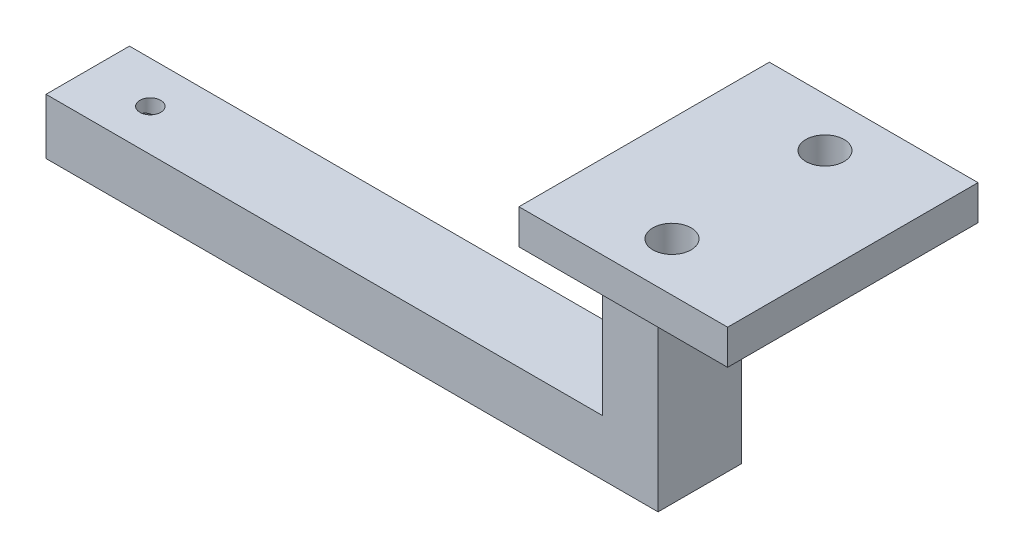
ISO-10303-21;
HEADER;
FILE_DESCRIPTION(('STEP AP214'),'2;1');
FILE_NAME('part.step','',(''),(''),'','','');
FILE_SCHEMA(('AUTOMOTIVE_DESIGN { 1 0 10303 214 1 1 1 1 }'));
ENDSEC;
DATA;
#1=APPLICATION_CONTEXT('core data for automotive mechanical design processes');
#2=APPLICATION_PROTOCOL_DEFINITION('international standard','automotive_design',2000,#1);
#3=PRODUCT_CONTEXT('',#1,'mechanical');
#4=PRODUCT('Part','Part','',(#3));
#5=PRODUCT_RELATED_PRODUCT_CATEGORY('part','',(#4));
#6=PRODUCT_DEFINITION_FORMATION('','',#4);
#7=PRODUCT_DEFINITION_CONTEXT('part definition',#1,'design');
#8=PRODUCT_DEFINITION('design','',#6,#7);
#9=PRODUCT_DEFINITION_SHAPE('','',#8);
#10=(LENGTH_UNIT() NAMED_UNIT(*) SI_UNIT(.MILLI.,.METRE.));
#11=(NAMED_UNIT(*) PLANE_ANGLE_UNIT() SI_UNIT($,.RADIAN.));
#12=(NAMED_UNIT(*) SI_UNIT($,.STERADIAN.) SOLID_ANGLE_UNIT());
#13=UNCERTAINTY_MEASURE_WITH_UNIT(LENGTH_MEASURE(1.E-05),#10,'distance_accuracy_value','');
#14=(GEOMETRIC_REPRESENTATION_CONTEXT(3) GLOBAL_UNCERTAINTY_ASSIGNED_CONTEXT((#13)) GLOBAL_UNIT_ASSIGNED_CONTEXT((#10,
#11,#12)) REPRESENTATION_CONTEXT('',''));
#15=CARTESIAN_POINT('',(0.,0.,0.));
#16=DIRECTION('',(0.,0.,1.));
#17=DIRECTION('',(1.,0.,0.));
#18=AXIS2_PLACEMENT_3D('',#15,#16,#17);
#19=CARTESIAN_POINT('',(0.,0.,12.));
#20=DIRECTION('',(-1.,0.,0.));
#21=DIRECTION('',(0.,0.,1.));
#22=AXIS2_PLACEMENT_3D('',#19,#20,#21);
#23=PLANE('',#22);
#24=DIRECTION('',(0.,0.,-1.));
#25=VECTOR('',#24,1.);
#26=CARTESIAN_POINT('',(0.,35.,12.));
#27=LINE('',#26,#25);
#28=CARTESIAN_POINT('',(0.,35.,12.));
#29=VERTEX_POINT('',#28);
#30=CARTESIAN_POINT('',(0.,35.,0.));
#31=VERTEX_POINT('',#30);
#32=EDGE_CURVE('E150',#29,#31,#27,.T.);
#33=ORIENTED_EDGE('',*,*,#32,.F.);
#34=DIRECTION('',(0.,1.,0.));
#35=VECTOR('',#34,1.);
#36=CARTESIAN_POINT('',(0.,0.,12.));
#37=LINE('',#36,#35);
#38=CARTESIAN_POINT('',(0.,0.,12.));
#39=VERTEX_POINT('',#38);
#40=EDGE_CURVE('E176',#39,#29,#37,.T.);
#41=ORIENTED_EDGE('',*,*,#40,.F.);
#42=DIRECTION('',(0.,0.,-1.));
#43=VECTOR('',#42,1.);
#44=CARTESIAN_POINT('',(0.,0.,12.));
#45=LINE('',#44,#43);
#46=CARTESIAN_POINT('',(0.,0.,0.));
#47=VERTEX_POINT('',#46);
#48=EDGE_CURVE('E207',#39,#47,#45,.T.);
#49=ORIENTED_EDGE('',*,*,#48,.T.);
#50=DIRECTION('',(0.,1.,0.));
#51=VECTOR('',#50,1.);
#52=CARTESIAN_POINT('',(0.,0.,0.));
#53=LINE('',#52,#51);
#54=EDGE_CURVE('E189',#47,#31,#53,.T.);
#55=ORIENTED_EDGE('',*,*,#54,.T.);
#56=EDGE_LOOP('',(#33,#41,#49,#55));
#57=FACE_BOUND('',#56,.T.);
#58=ADVANCED_FACE('F35',(#57),#23,.F.);
#59=CARTESIAN_POINT('',(0.,0.,12.));
#60=DIRECTION('',(0.,0.,1.));
#61=DIRECTION('',(1.,0.,0.));
#62=AXIS2_PLACEMENT_3D('',#59,#60,#61);
#63=PLANE('',#62);
#64=ORIENTED_EDGE('',*,*,#40,.T.);
#65=DIRECTION('',(-1.,0.,0.));
#66=VECTOR('',#65,1.);
#67=CARTESIAN_POINT('',(0.,35.,12.));
#68=LINE('',#67,#66);
#69=CARTESIAN_POINT('',(-8.,35.,12.));
#70=VERTEX_POINT('',#69);
#71=EDGE_CURVE('E152',#29,#70,#68,.T.);
#72=ORIENTED_EDGE('',*,*,#71,.T.);
#73=DIRECTION('',(0.,-1.,0.));
#74=VECTOR('',#73,1.);
#75=CARTESIAN_POINT('',(-8.,40.,12.));
#76=LINE('',#75,#74);
#77=CARTESIAN_POINT('',(-8.,8.00000000000001,12.));
#78=VERTEX_POINT('',#77);
#79=EDGE_CURVE('E180',#70,#78,#76,.T.);
#80=ORIENTED_EDGE('',*,*,#79,.T.);
#81=DIRECTION('',(-1.,0.,0.));
#82=VECTOR('',#81,1.);
#83=CARTESIAN_POINT('',(-8.,8.00000000000001,12.));
#84=LINE('',#83,#82);
#85=CARTESIAN_POINT('',(-88.,8.,12.));
#86=VERTEX_POINT('',#85);
#87=EDGE_CURVE('E182',#78,#86,#84,.T.);
#88=ORIENTED_EDGE('',*,*,#87,.T.);
#89=DIRECTION('',(0.,-1.,0.));
#90=VECTOR('',#89,1.);
#91=CARTESIAN_POINT('',(-88.,8.,12.));
#92=LINE('',#91,#90);
#93=CARTESIAN_POINT('',(-88.,0.,12.));
#94=VERTEX_POINT('',#93);
#95=EDGE_CURVE('E184',#86,#94,#92,.T.);
#96=ORIENTED_EDGE('',*,*,#95,.T.);
#97=DIRECTION('',(1.,0.,0.));
#98=VECTOR('',#97,1.);
#99=CARTESIAN_POINT('',(-88.,0.,12.));
#100=LINE('',#99,#98);
#101=EDGE_CURVE('E173',#94,#39,#100,.T.);
#102=ORIENTED_EDGE('',*,*,#101,.T.);
#103=EDGE_LOOP('',(#64,#72,#80,#88,#96,#102));
#104=FACE_BOUND('',#103,.T.);
#105=ADVANCED_FACE('F265',(#104),#63,.T.);
#106=CARTESIAN_POINT('',(0.,0.,0.));
#107=DIRECTION('',(0.,0.,1.));
#108=DIRECTION('',(1.,0.,0.));
#109=AXIS2_PLACEMENT_3D('',#106,#107,#108);
#110=PLANE('',#109);
#111=DIRECTION('',(-1.,0.,0.));
#112=VECTOR('',#111,1.);
#113=CARTESIAN_POINT('',(0.,35.,0.));
#114=LINE('',#113,#112);
#115=CARTESIAN_POINT('',(-8.,35.,0.));
#116=VERTEX_POINT('',#115);
#117=EDGE_CURVE('E11',#31,#116,#114,.T.);
#118=ORIENTED_EDGE('',*,*,#117,.F.);
#119=ORIENTED_EDGE('',*,*,#54,.F.);
#120=DIRECTION('',(1.,0.,0.));
#121=VECTOR('',#120,1.);
#122=CARTESIAN_POINT('',(-88.,0.,0.));
#123=LINE('',#122,#121);
#124=CARTESIAN_POINT('',(-88.,0.,0.));
#125=VERTEX_POINT('',#124);
#126=EDGE_CURVE('E172',#125,#47,#123,.T.);
#127=ORIENTED_EDGE('',*,*,#126,.F.);
#128=DIRECTION('',(0.,-1.,0.));
#129=VECTOR('',#128,1.);
#130=CARTESIAN_POINT('',(-88.,8.,0.));
#131=LINE('',#130,#129);
#132=CARTESIAN_POINT('',(-88.,8.,0.));
#133=VERTEX_POINT('',#132);
#134=EDGE_CURVE('E177',#133,#125,#131,.T.);
#135=ORIENTED_EDGE('',*,*,#134,.F.);
#136=DIRECTION('',(-1.,0.,0.));
#137=VECTOR('',#136,1.);
#138=CARTESIAN_POINT('',(-8.,8.00000000000001,0.));
#139=LINE('',#138,#137);
#140=CARTESIAN_POINT('',(-8.,8.00000000000001,0.));
#141=VERTEX_POINT('',#140);
#142=EDGE_CURVE('E194',#141,#133,#139,.T.);
#143=ORIENTED_EDGE('',*,*,#142,.F.);
#144=DIRECTION('',(0.,-1.,0.));
#145=VECTOR('',#144,1.);
#146=CARTESIAN_POINT('',(-8.,40.,0.));
#147=LINE('',#146,#145);
#148=EDGE_CURVE('E192',#116,#141,#147,.T.);
#149=ORIENTED_EDGE('',*,*,#148,.F.);
#150=EDGE_LOOP('',(#118,#119,#127,#135,#143,#149));
#151=FACE_BOUND('',#150,.T.);
#152=ADVANCED_FACE('F270',(#151),#110,.F.);
#153=CARTESIAN_POINT('',(-79.,-4.,6.00000000000001));
#154=DIRECTION('',(0.,1.,0.));
#155=DIRECTION('',(-1.,0.,0.));
#156=AXIS2_PLACEMENT_3D('',#153,#154,#155);
#157=CYLINDRICAL_SURFACE('',#156,1.5);
#158=CARTESIAN_POINT('',(-79.,0.,6.00000000000001));
#159=DIRECTION('',(0.,1.,0.));
#160=DIRECTION('',(0.,0.,1.));
#161=AXIS2_PLACEMENT_3D('',#158,#159,#160);
#162=CIRCLE('',#161,1.5);
#163=CARTESIAN_POINT('',(-79.,0.,7.50000000000001));
#164=VERTEX_POINT('',#163);
#165=EDGE_CURVE('E169',#164,#164,#162,.T.);
#166=ORIENTED_EDGE('',*,*,#165,.F.);
#167=EDGE_LOOP('',(#166));
#168=FACE_BOUND('',#167,.T.);
#169=CARTESIAN_POINT('',(-79.,8.,6.00000000000001));
#170=DIRECTION('',(0.,1.,0.));
#171=DIRECTION('',(-1.,0.,0.));
#172=AXIS2_PLACEMENT_3D('',#169,#170,#171);
#173=CIRCLE('',#172,1.5);
#174=CARTESIAN_POINT('',(-80.5,8.,6.00000000000001));
#175=VERTEX_POINT('',#174);
#176=EDGE_CURVE('E166',#175,#175,#173,.T.);
#177=ORIENTED_EDGE('',*,*,#176,.T.);
#178=EDGE_LOOP('',(#177));
#179=FACE_BOUND('',#178,.T.);
#180=DIRECTION('',(0.,1.,0.));
#181=VECTOR('',#180,1.);
#182=CARTESIAN_POINT('',(-79.,-4.,7.50000000000001));
#183=LINE('',#182,#181);
#184=CARTESIAN_POINT('',(-79.,5.67705098312484,7.50000000000001));
#185=VERTEX_POINT('',#184);
#186=CARTESIAN_POINT('',(-79.,2.32294901687516,7.50000000000001));
#187=VERTEX_POINT('',#186);
#188=EDGE_CURVE('E44',#185,#187,#183,.F.);
#189=ORIENTED_EDGE('',*,*,#188,.F.);
#190=CARTESIAN_POINT('',(-79.,5.67705098312484,7.50000000000001));
#191=CARTESIAN_POINT('',(-79.0368737272381,5.67703067467632,7.50000961376509));
#192=CARTESIAN_POINT('',(-79.0737348229495,5.67826657678591,7.49864076162754));
#193=CARTESIAN_POINT('',(-79.1470562549286,5.68309455362902,7.49322342700927));
#194=CARTESIAN_POINT('',(-79.1835170617744,5.68668347083958,7.48917853545359));
#195=CARTESIAN_POINT('',(-79.255406471104,5.69601572525516,7.47853880590408));
#196=CARTESIAN_POINT('',(-79.2908417088637,5.70173745357129,7.4719695241817));
#197=CARTESIAN_POINT('',(-79.3608074285523,5.71508074522219,7.45640091046217));
#198=CARTESIAN_POINT('',(-79.3953376441059,5.7227028611102,7.44740087163904));
#199=CARTESIAN_POINT('',(-79.4969137851983,5.74789625130087,7.41705570383185));
#200=CARTESIAN_POINT('',(-79.5623786136168,5.76785698911783,7.39229898340003));
#201=CARTESIAN_POINT('',(-79.688251672616,5.81181841370198,7.33459008750629));
#202=CARTESIAN_POINT('',(-79.7486448716587,5.83583051616502,7.30161462484354));
#203=CARTESIAN_POINT('',(-79.872749943181,5.88960327142749,7.22250683593719));
#204=CARTESIAN_POINT('',(-79.9355336804138,5.91967897989029,7.17512904818831));
#205=CARTESIAN_POINT('',(-80.0530342315155,5.97960330566497,7.07111173647231));
#206=CARTESIAN_POINT('',(-80.1077477189671,6.00945182455246,7.01446841358679));
#207=CARTESIAN_POINT('',(-80.2154796019136,6.07066451454946,6.88362112846635));
#208=CARTESIAN_POINT('',(-80.2671068209244,6.10162290735535,6.80806212468701));
#209=CARTESIAN_POINT('',(-80.3564780428269,6.15668632689625,6.64686141885877));
#210=CARTESIAN_POINT('',(-80.3942362392146,6.18079835440094,6.5612301439194));
#211=CARTESIAN_POINT('',(-80.4501673755483,6.21699936644745,6.39243652101455));
#212=CARTESIAN_POINT('',(-80.4700626452566,6.23013391051135,6.31007545310938));
#213=CARTESIAN_POINT('',(-80.495638413666,6.24707311914143,6.14227097413039));
#214=CARTESIAN_POINT('',(-80.5013369150397,6.25088959965741,6.05683160629038));
#215=CARTESIAN_POINT('',(-80.4983706611973,6.24891521257682,5.89938970239933));
#216=CARTESIAN_POINT('',(-80.4917582097064,6.2444969854291,5.82731950071986));
#217=CARTESIAN_POINT('',(-80.4684317065219,6.22906136785031,5.68557100471714));
#218=CARTESIAN_POINT('',(-80.4517169210434,6.21804349805346,5.61589288453176));
#219=CARTESIAN_POINT('',(-80.4091032402396,6.19039068899814,5.48094155366911));
#220=CARTESIAN_POINT('',(-80.3832408478575,6.17377808758957,5.41565204526851));
#221=CARTESIAN_POINT('',(-80.323334768453,6.13615828863141,5.29034314982622));
#222=CARTESIAN_POINT('',(-80.2892895863376,6.11515028808117,5.23032472861416));
#223=CARTESIAN_POINT('',(-80.2090153610089,6.06713506872456,5.10878585132561));
#224=CARTESIAN_POINT('',(-80.161773105589,6.03970226477187,5.04810463700618));
#225=CARTESIAN_POINT('',(-80.0590742815934,5.98300368004118,4.93500743627833));
#226=CARTESIAN_POINT('',(-80.0036052745488,5.95373516310972,4.88260421798713));
#227=CARTESIAN_POINT('',(-79.8760380413454,5.89113018974347,4.77921630448056));
#228=CARTESIAN_POINT('',(-79.8026949930549,5.857866938289,4.72971244142493));
#229=CARTESIAN_POINT('',(-79.6468899250284,5.79607563731148,4.64374922011654));
#230=CARTESIAN_POINT('',(-79.5644407795887,5.76754104163314,4.60727174643706));
#231=CARTESIAN_POINT('',(-79.416007710492,5.72684542118096,4.55735028799181));
#232=CARTESIAN_POINT('',(-79.3518757751779,5.71233693234825,4.54031691504824));
#233=CARTESIAN_POINT('',(-79.2208496796857,5.69031117927188,4.51485953286931));
#234=CARTESIAN_POINT('',(-79.1539654762302,5.68277069278361,4.50640691721251));
#235=CARTESIAN_POINT('',(-79.0722838158817,5.67854474224225,4.50167205945649));
#236=CARTESIAN_POINT('',(-79.0578380103831,5.67798516974101,4.50104528821663));
#237=CARTESIAN_POINT('',(-79.028929713638,5.67723891261461,4.50020974713611));
#238=CARTESIAN_POINT('',(-79.0144672299445,5.67705209833551,4.50000083195537));
#239=CARTESIAN_POINT('',(-78.9999999999999,5.67705098312628,4.5));
#240=B_SPLINE_CURVE_WITH_KNOTS('',3,(#190,#191,#192,#193,#194,#195,#196,#197,#198,#199,#200,
#201,#202,#203,#204,#205,#206,#207,#208,#209,#210,#211,#212,#213,#214,#215,#216,#217,#218,#219,
#220,#221,#222,#223,#224,#225,#226,#227,#228,#229,#230,#231,#232,#233,#234,#235,#236,#237,#238,
#239),.UNSPECIFIED.,.F.,.F.,(4,2,2,2,2,2,2,2,2,2,2,2,2,2,2,2,2,2,2,2,2,2,2,2,4),(0.,
0.110554725515257,0.220961399887614,0.330278601396378,0.439627624917945,0.657013960845389,
0.87502339018235,1.12670489505225,1.37848985051489,1.66671240875328,1.95463917401578,
2.210255480478,2.46554747902458,2.68201999729834,2.89850824098444,3.11414217137482,
3.32981553063517,3.57383340863398,3.81822406427426,4.10052257128099,4.38242695081471,
4.58541483303322,4.78772375216627,4.83112836335763,4.87451787478567),.UNSPECIFIED.);
#241=CARTESIAN_POINT('',(-79.,5.67705098312485,4.50000000000001));
#242=VERTEX_POINT('',#241);
#243=EDGE_CURVE('E212',#185,#242,#240,.T.);
#244=ORIENTED_EDGE('',*,*,#243,.T.);
#245=DIRECTION('',(0.,1.,0.));
#246=VECTOR('',#245,1.);
#247=CARTESIAN_POINT('',(-79.,-4.,4.50000000000001));
#248=LINE('',#247,#246);
#249=CARTESIAN_POINT('',(-79.,2.32294901687515,4.50000000000001));
#250=VERTEX_POINT('',#249);
#251=EDGE_CURVE('E210',#250,#242,#248,.T.);
#252=ORIENTED_EDGE('',*,*,#251,.F.);
#253=CARTESIAN_POINT('',(-79.,2.32294901687515,4.50000000000001));
#254=CARTESIAN_POINT('',(-79.0368737272381,2.32296932532366,4.49999038623492));
#255=CARTESIAN_POINT('',(-79.0737348229495,2.32173342321407,4.50135923837248));
#256=CARTESIAN_POINT('',(-79.1470562549286,2.31690544637096,4.50677657299075));
#257=CARTESIAN_POINT('',(-79.1835170617744,2.3133165291604,4.51082146454643));
#258=CARTESIAN_POINT('',(-79.255406471104,2.30398427474482,4.52146119409594));
#259=CARTESIAN_POINT('',(-79.2908417088637,2.29826254642869,4.52803047581832));
#260=CARTESIAN_POINT('',(-79.3608074285523,2.28491925477779,4.54359908953785));
#261=CARTESIAN_POINT('',(-79.3953376441059,2.27729713888978,4.55259912836098));
#262=CARTESIAN_POINT('',(-79.4969137851983,2.25210374869911,4.58294429616817));
#263=CARTESIAN_POINT('',(-79.5623786136168,2.23214301088215,4.60770101659999));
#264=CARTESIAN_POINT('',(-79.688251672616,2.18818158629801,4.66540991249373));
#265=CARTESIAN_POINT('',(-79.7486448716587,2.16416948383496,4.69838537515649));
#266=CARTESIAN_POINT('',(-79.872749943181,2.11039672857249,4.77749316406283));
#267=CARTESIAN_POINT('',(-79.9355336804138,2.08032102010969,4.82487095181171));
#268=CARTESIAN_POINT('',(-80.0530342315155,2.02039669433502,4.92888826352771));
#269=CARTESIAN_POINT('',(-80.1077477189671,1.99054817544753,4.98553158641324));
#270=CARTESIAN_POINT('',(-80.2154796019136,1.92933548545053,5.11637887153367));
#271=CARTESIAN_POINT('',(-80.2671068209244,1.89837709264464,5.191937875313));
#272=CARTESIAN_POINT('',(-80.3564780428269,1.84331367310374,5.35313858114125));
#273=CARTESIAN_POINT('',(-80.3942362392146,1.81920164559905,5.43876985608062));
#274=CARTESIAN_POINT('',(-80.4501673755483,1.78300063355255,5.60756347898547));
#275=CARTESIAN_POINT('',(-80.4700626452566,1.76986608948864,5.68992454689064));
#276=CARTESIAN_POINT('',(-80.495638413666,1.75292688085857,5.85772902586963));
#277=CARTESIAN_POINT('',(-80.5013369150397,1.74911040034259,5.94316839370964));
#278=CARTESIAN_POINT('',(-80.4983706611973,1.75108478742319,6.10061029760069));
#279=CARTESIAN_POINT('',(-80.4917582097064,1.7555030145709,6.17268049928016));
#280=CARTESIAN_POINT('',(-80.4684317065219,1.7709386321497,6.31442899528288));
#281=CARTESIAN_POINT('',(-80.4517169210434,1.78195650194655,6.38410711546826));
#282=CARTESIAN_POINT('',(-80.4091032402396,1.80960931100187,6.51905844633091));
#283=CARTESIAN_POINT('',(-80.3832408478575,1.82622191241044,6.5843479547315));
#284=CARTESIAN_POINT('',(-80.323334768453,1.86384171136859,6.7096568501738));
#285=CARTESIAN_POINT('',(-80.2892895863376,1.88484971191884,6.76967527138586));
#286=CARTESIAN_POINT('',(-80.2090153610089,1.93286493127545,6.89121414867441));
#287=CARTESIAN_POINT('',(-80.161773105589,1.96029773522814,6.95189536299384));
#288=CARTESIAN_POINT('',(-80.0590742815934,2.01699631995884,7.06499256372169));
#289=CARTESIAN_POINT('',(-80.0036052745488,2.0462648368903,7.11739578201289));
#290=CARTESIAN_POINT('',(-79.8760380413454,2.10886981025654,7.22078369551947));
#291=CARTESIAN_POINT('',(-79.8026949930549,2.14213306171102,7.2702875585751));
#292=CARTESIAN_POINT('',(-79.6468899250284,2.20392436268854,7.35625077988349));
#293=CARTESIAN_POINT('',(-79.5644407795887,2.23245895836688,7.39272825356296));
#294=CARTESIAN_POINT('',(-79.4160077104919,2.27315457881906,7.44264971200821));
#295=CARTESIAN_POINT('',(-79.3518757751779,2.28766306765177,7.45968308495178));
#296=CARTESIAN_POINT('',(-79.2208496796857,2.30968882072814,7.48514046713071));
#297=CARTESIAN_POINT('',(-79.1539654762301,2.31722930721642,7.4935930827875));
#298=CARTESIAN_POINT('',(-79.0722838158817,2.32145525775777,7.49832794054353));
#299=CARTESIAN_POINT('',(-79.0578380103831,2.32201483025901,7.49895471178339));
#300=CARTESIAN_POINT('',(-79.028929713638,2.3227610873854,7.49979025286391));
#301=CARTESIAN_POINT('',(-79.0144672299445,2.3229479016645,7.49999916804465));
#302=CARTESIAN_POINT('',(-78.9999999999999,2.32294901687374,7.50000000000002));
#303=B_SPLINE_CURVE_WITH_KNOTS('',3,(#253,#254,#255,#256,#257,#258,#259,#260,#261,#262,#263,
#264,#265,#266,#267,#268,#269,#270,#271,#272,#273,#274,#275,#276,#277,#278,#279,#280,#281,#282,
#283,#284,#285,#286,#287,#288,#289,#290,#291,#292,#293,#294,#295,#296,#297,#298,#299,#300,#301,
#302),.UNSPECIFIED.,.F.,.F.,(4,2,2,2,2,2,2,2,2,2,2,2,2,2,2,2,2,2,2,2,2,2,2,2,4),(0.,
0.110554725515256,0.220961399887614,0.330278601396378,0.439627624917945,0.657013960845388,
0.875023390182365,1.12670489505225,1.37848985051489,1.66671240875327,1.95463917401577,
2.21025548047799,2.46554747902458,2.68201999729833,2.89850824098443,3.11414217137482,
3.32981553063517,3.57383340863398,3.81822406427428,4.10052257128099,4.38242695081471,
4.58541483303326,4.78772375216627,4.83112836335763,4.87451787478567),.UNSPECIFIED.);
#304=EDGE_CURVE('E221',#250,#187,#303,.T.);
#305=ORIENTED_EDGE('',*,*,#304,.T.);
#306=EDGE_LOOP('',(#189,#244,#252,#305));
#307=FACE_BOUND('',#306,.T.);
#308=ADVANCED_FACE('F227',(#168,#179,#307),#157,.F.);
#309=CARTESIAN_POINT('',(-88.,0.,12.));
#310=DIRECTION('',(0.,1.,0.));
#311=DIRECTION('',(0.,0.,1.));
#312=AXIS2_PLACEMENT_3D('',#309,#310,#311);
#313=PLANE('',#312);
#314=ORIENTED_EDGE('',*,*,#165,.T.);
#315=EDGE_LOOP('',(#314));
#316=FACE_BOUND('',#315,.T.);
#317=ORIENTED_EDGE('',*,*,#126,.T.);
#318=ORIENTED_EDGE('',*,*,#48,.F.);
#319=ORIENTED_EDGE('',*,*,#101,.F.);
#320=DIRECTION('',(0.,0.,-1.));
#321=VECTOR('',#320,1.);
#322=CARTESIAN_POINT('',(-88.,0.,12.));
#323=LINE('',#322,#321);
#324=EDGE_CURVE('E186',#94,#125,#323,.T.);
#325=ORIENTED_EDGE('',*,*,#324,.T.);
#326=EDGE_LOOP('',(#317,#318,#319,#325));
#327=FACE_BOUND('',#326,.T.);
#328=ADVANCED_FACE('F37',(#316,#327),#313,.F.);
#329=CARTESIAN_POINT('',(0.,40.,12.));
#330=DIRECTION('',(0.,-1.,0.));
#331=DIRECTION('',(1.,0.,0.));
#332=AXIS2_PLACEMENT_3D('',#329,#330,#331);
#333=PLANE('',#332);
#334=CARTESIAN_POINT('',(6.99999999999998,40.,17.));
#335=DIRECTION('',(0.,1.,0.));
#336=DIRECTION('',(-1.,0.,0.));
#337=AXIS2_PLACEMENT_3D('',#334,#335,#336);
#338=CIRCLE('',#337,2.75);
#339=CARTESIAN_POINT('',(4.24999999999998,40.,17.));
#340=VERTEX_POINT('',#339);
#341=EDGE_CURVE('E325',#340,#340,#338,.T.);
#342=ORIENTED_EDGE('',*,*,#341,.F.);
#343=EDGE_LOOP('',(#342));
#344=FACE_BOUND('',#343,.T.);
#345=CARTESIAN_POINT('',(6.99999999999998,40.,-5.));
#346=DIRECTION('',(0.,1.,0.));
#347=DIRECTION('',(-1.,0.,0.));
#348=AXIS2_PLACEMENT_3D('',#345,#346,#347);
#349=CIRCLE('',#348,2.75);
#350=CARTESIAN_POINT('',(4.24999999999998,40.,-5.));
#351=VERTEX_POINT('',#350);
#352=EDGE_CURVE('E328',#351,#351,#349,.T.);
#353=ORIENTED_EDGE('',*,*,#352,.F.);
#354=EDGE_LOOP('',(#353));
#355=FACE_BOUND('',#354,.T.);
#356=DIRECTION('',(0.,0.,-1.));
#357=VECTOR('',#356,1.);
#358=CARTESIAN_POINT('',(-8.,40.,12.));
#359=LINE('',#358,#357);
#360=CARTESIAN_POINT('',(-8.,40.,24.));
#361=VERTEX_POINT('',#360);
#362=CARTESIAN_POINT('',(-8.,40.,-12.));
#363=VERTEX_POINT('',#362);
#364=EDGE_CURVE('E205',#361,#363,#359,.T.);
#365=ORIENTED_EDGE('',*,*,#364,.F.);
#366=DIRECTION('',(-1.,0.,0.));
#367=VECTOR('',#366,1.);
#368=CARTESIAN_POINT('',(22.,40.,24.));
#369=LINE('',#368,#367);
#370=CARTESIAN_POINT('',(22.,40.,24.));
#371=VERTEX_POINT('',#370);
#372=EDGE_CURVE('E317',#371,#361,#369,.T.);
#373=ORIENTED_EDGE('',*,*,#372,.F.);
#374=DIRECTION('',(0.,0.,1.));
#375=VECTOR('',#374,1.);
#376=CARTESIAN_POINT('',(22.,40.,24.));
#377=LINE('',#376,#375);
#378=CARTESIAN_POINT('',(22.,40.,-12.));
#379=VERTEX_POINT('',#378);
#380=EDGE_CURVE('E141',#379,#371,#377,.T.);
#381=ORIENTED_EDGE('',*,*,#380,.F.);
#382=DIRECTION('',(-1.,0.,0.));
#383=VECTOR('',#382,1.);
#384=CARTESIAN_POINT('',(22.,40.,-12.));
#385=LINE('',#384,#383);
#386=EDGE_CURVE('E154',#379,#363,#385,.T.);
#387=ORIENTED_EDGE('',*,*,#386,.T.);
#388=EDGE_LOOP('',(#365,#373,#381,#387));
#389=FACE_BOUND('',#388,.T.);
#390=ADVANCED_FACE('F274',(#344,#355,#389),#333,.F.);
#391=CARTESIAN_POINT('',(-8.,40.,12.));
#392=DIRECTION('',(1.,0.,0.));
#393=DIRECTION('',(0.,1.,0.));
#394=AXIS2_PLACEMENT_3D('',#391,#392,#393);
#395=PLANE('',#394);
#396=ORIENTED_EDGE('',*,*,#364,.T.);
#397=DIRECTION('',(0.,1.,0.));
#398=VECTOR('',#397,1.);
#399=CARTESIAN_POINT('',(-8.,40.,-12.));
#400=LINE('',#399,#398);
#401=CARTESIAN_POINT('',(-8.,35.,-12.));
#402=VERTEX_POINT('',#401);
#403=EDGE_CURVE('E145',#402,#363,#400,.T.);
#404=ORIENTED_EDGE('',*,*,#403,.F.);
#405=DIRECTION('',(0.,0.,-1.));
#406=VECTOR('',#405,1.);
#407=CARTESIAN_POINT('',(-8.,35.,24.));
#408=LINE('',#407,#406);
#409=EDGE_CURVE('E52',#116,#402,#408,.T.);
#410=ORIENTED_EDGE('',*,*,#409,.F.);
#411=ORIENTED_EDGE('',*,*,#148,.T.);
#412=DIRECTION('',(0.,0.,-1.));
#413=VECTOR('',#412,1.);
#414=CARTESIAN_POINT('',(-8.,8.00000000000001,12.));
#415=LINE('',#414,#413);
#416=EDGE_CURVE('E202',#78,#141,#415,.T.);
#417=ORIENTED_EDGE('',*,*,#416,.F.);
#418=ORIENTED_EDGE('',*,*,#79,.F.);
#419=CARTESIAN_POINT('',(-8.,35.,24.));
#420=VERTEX_POINT('',#419);
#421=EDGE_CURVE('E310',#420,#70,#408,.T.);
#422=ORIENTED_EDGE('',*,*,#421,.F.);
#423=DIRECTION('',(0.,-1.,0.));
#424=VECTOR('',#423,1.);
#425=CARTESIAN_POINT('',(-8.,40.,24.));
#426=LINE('',#425,#424);
#427=EDGE_CURVE('E149',#361,#420,#426,.T.);
#428=ORIENTED_EDGE('',*,*,#427,.F.);
#429=EDGE_LOOP('',(#396,#404,#410,#411,#417,#418,#422,#428));
#430=FACE_BOUND('',#429,.T.);
#431=ADVANCED_FACE('F277',(#430),#395,.F.);
#432=CARTESIAN_POINT('',(-8.,8.00000000000001,12.));
#433=DIRECTION('',(0.,-1.,0.));
#434=DIRECTION('',(1.,0.,0.));
#435=AXIS2_PLACEMENT_3D('',#432,#433,#434);
#436=PLANE('',#435);
#437=ORIENTED_EDGE('',*,*,#176,.F.);
#438=EDGE_LOOP('',(#437));
#439=FACE_BOUND('',#438,.T.);
#440=ORIENTED_EDGE('',*,*,#142,.T.);
#441=DIRECTION('',(0.,0.,-1.));
#442=VECTOR('',#441,1.);
#443=CARTESIAN_POINT('',(-88.,8.,12.));
#444=LINE('',#443,#442);
#445=EDGE_CURVE('E199',#86,#133,#444,.T.);
#446=ORIENTED_EDGE('',*,*,#445,.F.);
#447=ORIENTED_EDGE('',*,*,#87,.F.);
#448=ORIENTED_EDGE('',*,*,#416,.T.);
#449=EDGE_LOOP('',(#440,#446,#447,#448));
#450=FACE_BOUND('',#449,.T.);
#451=ADVANCED_FACE('F281',(#439,#450),#436,.F.);
#452=CARTESIAN_POINT('',(-88.,8.,12.));
#453=DIRECTION('',(1.,0.,0.));
#454=DIRECTION('',(0.,0.,-1.));
#455=AXIS2_PLACEMENT_3D('',#452,#453,#454);
#456=PLANE('',#455);
#457=CARTESIAN_POINT('',(-88.,4.,6.));
#458=DIRECTION('',(-1.,0.,0.));
#459=DIRECTION('',(0.,0.,1.));
#460=AXIS2_PLACEMENT_3D('',#457,#458,#459);
#461=CIRCLE('',#460,2.25);
#462=CARTESIAN_POINT('',(-88.,4.,8.25));
#463=VERTEX_POINT('',#462);
#464=EDGE_CURVE('E160',#463,#463,#461,.T.);
#465=ORIENTED_EDGE('',*,*,#464,.F.);
#466=EDGE_LOOP('',(#465));
#467=FACE_BOUND('',#466,.T.);
#468=ORIENTED_EDGE('',*,*,#134,.T.);
#469=ORIENTED_EDGE('',*,*,#324,.F.);
#470=ORIENTED_EDGE('',*,*,#95,.F.);
#471=ORIENTED_EDGE('',*,*,#445,.T.);
#472=EDGE_LOOP('',(#468,#469,#470,#471));
#473=FACE_BOUND('',#472,.T.);
#474=ADVANCED_FACE('F235',(#467,#473),#456,.F.);
#475=CARTESIAN_POINT('',(-79.,4.,6.));
#476=DIRECTION('',(-1.,0.,0.));
#477=DIRECTION('',(0.,0.,1.));
#478=AXIS2_PLACEMENT_3D('',#475,#476,#477);
#479=CYLINDRICAL_SURFACE('',#478,2.25);
#480=ORIENTED_EDGE('',*,*,#464,.T.);
#481=EDGE_LOOP('',(#480));
#482=FACE_BOUND('',#481,.T.);
#483=CARTESIAN_POINT('',(-79.,4.,6.));
#484=DIRECTION('',(-1.,0.,0.));
#485=DIRECTION('',(0.,0.,1.));
#486=AXIS2_PLACEMENT_3D('',#483,#484,#485);
#487=CIRCLE('',#486,2.25);
#488=EDGE_CURVE('E58',#242,#250,#487,.T.);
#489=ORIENTED_EDGE('',*,*,#488,.F.);
#490=ORIENTED_EDGE('',*,*,#243,.F.);
#491=EDGE_CURVE('E161',#187,#185,#487,.T.);
#492=ORIENTED_EDGE('',*,*,#491,.F.);
#493=ORIENTED_EDGE('',*,*,#304,.F.);
#494=EDGE_LOOP('',(#489,#490,#492,#493));
#495=FACE_BOUND('',#494,.T.);
#496=ADVANCED_FACE('F230',(#482,#495),#479,.F.);
#497=CARTESIAN_POINT('',(-79.,4.,6.));
#498=DIRECTION('',(-1.,0.,0.));
#499=DIRECTION('',(0.,0.,1.));
#500=AXIS2_PLACEMENT_3D('',#497,#498,#499);
#501=PLANE('',#500);
#502=ORIENTED_EDGE('',*,*,#188,.T.);
#503=ORIENTED_EDGE('',*,*,#491,.T.);
#504=EDGE_LOOP('',(#502,#503));
#505=FACE_BOUND('',#504,.T.);
#506=ADVANCED_FACE('F234',(#505),#501,.T.);
#507=ORIENTED_EDGE('',*,*,#251,.T.);
#508=ORIENTED_EDGE('',*,*,#488,.T.);
#509=EDGE_LOOP('',(#507,#508));
#510=FACE_BOUND('',#509,.T.);
#511=ADVANCED_FACE('F240',(#510),#501,.T.);
#512=CARTESIAN_POINT('',(22.,40.,24.));
#513=DIRECTION('',(0.,0.,-1.));
#514=DIRECTION('',(-1.,0.,0.));
#515=AXIS2_PLACEMENT_3D('',#512,#513,#514);
#516=PLANE('',#515);
#517=ORIENTED_EDGE('',*,*,#427,.T.);
#518=DIRECTION('',(-1.,0.,0.));
#519=VECTOR('',#518,1.);
#520=CARTESIAN_POINT('',(22.,35.,24.));
#521=LINE('',#520,#519);
#522=CARTESIAN_POINT('',(22.,35.,24.));
#523=VERTEX_POINT('',#522);
#524=EDGE_CURVE('E129',#523,#420,#521,.T.);
#525=ORIENTED_EDGE('',*,*,#524,.F.);
#526=DIRECTION('',(0.,-1.,0.));
#527=VECTOR('',#526,1.);
#528=CARTESIAN_POINT('',(22.,40.,24.));
#529=LINE('',#528,#527);
#530=EDGE_CURVE('E136',#371,#523,#529,.T.);
#531=ORIENTED_EDGE('',*,*,#530,.F.);
#532=ORIENTED_EDGE('',*,*,#372,.T.);
#533=EDGE_LOOP('',(#517,#525,#531,#532));
#534=FACE_BOUND('',#533,.T.);
#535=ADVANCED_FACE('F147',(#534),#516,.F.);
#536=CARTESIAN_POINT('',(22.,35.,24.));
#537=DIRECTION('',(0.,1.,0.));
#538=DIRECTION('',(-1.,0.,0.));
#539=AXIS2_PLACEMENT_3D('',#536,#537,#538);
#540=PLANE('',#539);
#541=CARTESIAN_POINT('',(6.99999999999998,35.,17.));
#542=DIRECTION('',(0.,1.,0.));
#543=DIRECTION('',(-1.,0.,0.));
#544=AXIS2_PLACEMENT_3D('',#541,#542,#543);
#545=CIRCLE('',#544,2.75);
#546=CARTESIAN_POINT('',(4.24999999999998,35.,17.));
#547=VERTEX_POINT('',#546);
#548=EDGE_CURVE('E39',#547,#547,#545,.T.);
#549=ORIENTED_EDGE('',*,*,#548,.T.);
#550=EDGE_LOOP('',(#549));
#551=FACE_BOUND('',#550,.T.);
#552=CARTESIAN_POINT('',(6.99999999999998,35.,-5.));
#553=DIRECTION('',(0.,1.,0.));
#554=DIRECTION('',(-1.,0.,0.));
#555=AXIS2_PLACEMENT_3D('',#552,#553,#554);
#556=CIRCLE('',#555,2.75);
#557=CARTESIAN_POINT('',(4.24999999999998,35.,-5.));
#558=VERTEX_POINT('',#557);
#559=EDGE_CURVE('E322',#558,#558,#556,.T.);
#560=ORIENTED_EDGE('',*,*,#559,.T.);
#561=EDGE_LOOP('',(#560));
#562=FACE_BOUND('',#561,.T.);
#563=ORIENTED_EDGE('',*,*,#71,.F.);
#564=ORIENTED_EDGE('',*,*,#32,.T.);
#565=ORIENTED_EDGE('',*,*,#117,.T.);
#566=ORIENTED_EDGE('',*,*,#409,.T.);
#567=DIRECTION('',(-1.,0.,0.));
#568=VECTOR('',#567,1.);
#569=CARTESIAN_POINT('',(22.,35.,-12.));
#570=LINE('',#569,#568);
#571=CARTESIAN_POINT('',(22.,35.,-12.));
#572=VERTEX_POINT('',#571);
#573=EDGE_CURVE('E132',#572,#402,#570,.T.);
#574=ORIENTED_EDGE('',*,*,#573,.F.);
#575=DIRECTION('',(0.,0.,-1.));
#576=VECTOR('',#575,1.);
#577=CARTESIAN_POINT('',(22.,35.,24.));
#578=LINE('',#577,#576);
#579=EDGE_CURVE('E125',#523,#572,#578,.T.);
#580=ORIENTED_EDGE('',*,*,#579,.F.);
#581=ORIENTED_EDGE('',*,*,#524,.T.);
#582=ORIENTED_EDGE('',*,*,#421,.T.);
#583=EDGE_LOOP('',(#563,#564,#565,#566,#574,#580,#581,#582));
#584=FACE_BOUND('',#583,.T.);
#585=ADVANCED_FACE('F127',(#551,#562,#584),#540,.F.);
#586=CARTESIAN_POINT('',(22.,40.,-12.));
#587=DIRECTION('',(0.,0.,1.));
#588=DIRECTION('',(0.,-1.,0.));
#589=AXIS2_PLACEMENT_3D('',#586,#587,#588);
#590=PLANE('',#589);
#591=ORIENTED_EDGE('',*,*,#403,.T.);
#592=ORIENTED_EDGE('',*,*,#386,.F.);
#593=DIRECTION('',(0.,1.,0.));
#594=VECTOR('',#593,1.);
#595=CARTESIAN_POINT('',(22.,40.,-12.));
#596=LINE('',#595,#594);
#597=EDGE_CURVE('E135',#572,#379,#596,.T.);
#598=ORIENTED_EDGE('',*,*,#597,.F.);
#599=ORIENTED_EDGE('',*,*,#573,.T.);
#600=EDGE_LOOP('',(#591,#592,#598,#599));
#601=FACE_BOUND('',#600,.T.);
#602=ADVANCED_FACE('F246',(#601),#590,.F.);
#603=CARTESIAN_POINT('',(22.,0.,0.));
#604=DIRECTION('',(1.,0.,0.));
#605=DIRECTION('',(0.,1.,0.));
#606=AXIS2_PLACEMENT_3D('',#603,#604,#605);
#607=PLANE('',#606);
#608=ORIENTED_EDGE('',*,*,#530,.T.);
#609=ORIENTED_EDGE('',*,*,#579,.T.);
#610=ORIENTED_EDGE('',*,*,#597,.T.);
#611=ORIENTED_EDGE('',*,*,#380,.T.);
#612=EDGE_LOOP('',(#608,#609,#610,#611));
#613=FACE_BOUND('',#612,.T.);
#614=ADVANCED_FACE('F139',(#613),#607,.T.);
#615=CARTESIAN_POINT('',(6.99999999999999,10.,-5.));
#616=DIRECTION('',(0.,1.,0.));
#617=DIRECTION('',(-1.,0.,0.));
#618=AXIS2_PLACEMENT_3D('',#615,#616,#617);
#619=CYLINDRICAL_SURFACE('',#618,2.75);
#620=ORIENTED_EDGE('',*,*,#352,.T.);
#621=EDGE_LOOP('',(#620));
#622=FACE_BOUND('',#621,.T.);
#623=ORIENTED_EDGE('',*,*,#559,.F.);
#624=EDGE_LOOP('',(#623));
#625=FACE_BOUND('',#624,.T.);
#626=ADVANCED_FACE('F253',(#622,#625),#619,.F.);
#627=CARTESIAN_POINT('',(6.99999999999999,10.,17.));
#628=DIRECTION('',(0.,1.,0.));
#629=DIRECTION('',(-1.,0.,0.));
#630=AXIS2_PLACEMENT_3D('',#627,#628,#629);
#631=CYLINDRICAL_SURFACE('',#630,2.75);
#632=ORIENTED_EDGE('',*,*,#341,.T.);
#633=EDGE_LOOP('',(#632));
#634=FACE_BOUND('',#633,.T.);
#635=ORIENTED_EDGE('',*,*,#548,.F.);
#636=EDGE_LOOP('',(#635));
#637=FACE_BOUND('',#636,.T.);
#638=ADVANCED_FACE('F256',(#634,#637),#631,.F.);
#639=CLOSED_SHELL('',(#58,#105,#152,#308,#328,#390,#431,#451,#474,#496,#506,#511,#535,#585,#602,
#614,#626,#638));
#640=MANIFOLD_SOLID_BREP('B2',#639);
#641=ADVANCED_BREP_SHAPE_REPRESENTATION('',(#18,#640),#14);
#642=SHAPE_DEFINITION_REPRESENTATION(#9,#641);
ENDSEC;
END-ISO-10303-21;
